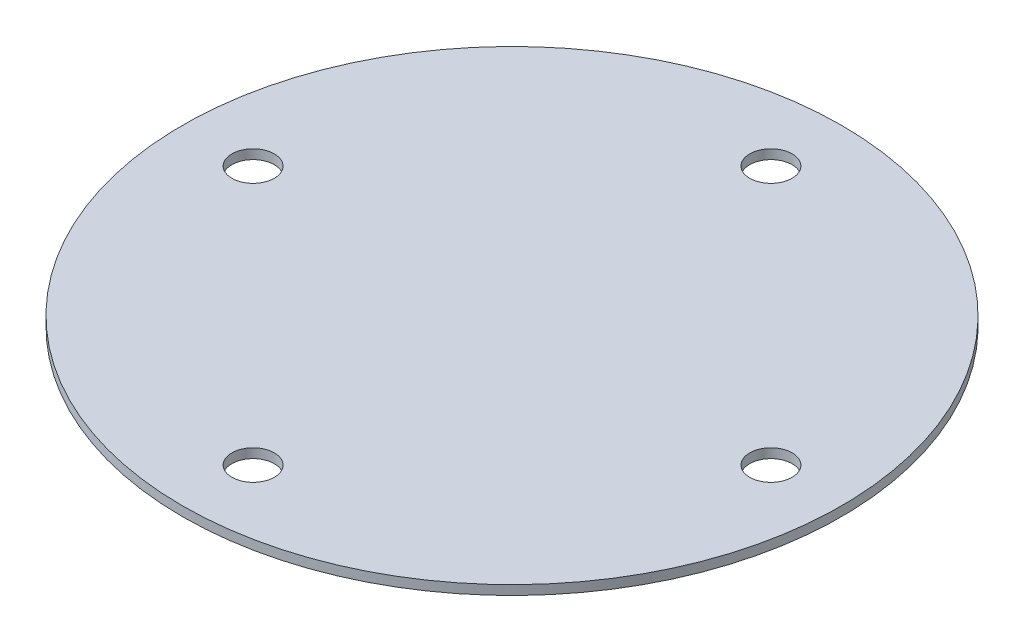
ISO-10303-21;
HEADER;
FILE_DESCRIPTION(('STEP AP214'),'2;1');
FILE_NAME('part.step','',(''),(''),'','','');
FILE_SCHEMA(('AUTOMOTIVE_DESIGN { 1 0 10303 214 1 1 1 1 }'));
ENDSEC;
DATA;
#1=APPLICATION_CONTEXT('core data for automotive mechanical design processes');
#2=APPLICATION_PROTOCOL_DEFINITION('international standard','automotive_design',2000,#1);
#3=PRODUCT_CONTEXT('',#1,'mechanical');
#4=PRODUCT('Part','Part','',(#3));
#5=PRODUCT_RELATED_PRODUCT_CATEGORY('part','',(#4));
#6=PRODUCT_DEFINITION_FORMATION('','',#4);
#7=PRODUCT_DEFINITION_CONTEXT('part definition',#1,'design');
#8=PRODUCT_DEFINITION('design','',#6,#7);
#9=PRODUCT_DEFINITION_SHAPE('','',#8);
#10=(LENGTH_UNIT() NAMED_UNIT(*) SI_UNIT(.MILLI.,.METRE.));
#11=(NAMED_UNIT(*) PLANE_ANGLE_UNIT() SI_UNIT($,.RADIAN.));
#12=(NAMED_UNIT(*) SI_UNIT($,.STERADIAN.) SOLID_ANGLE_UNIT());
#13=UNCERTAINTY_MEASURE_WITH_UNIT(LENGTH_MEASURE(1.E-05),#10,'distance_accuracy_value','');
#14=(GEOMETRIC_REPRESENTATION_CONTEXT(3) GLOBAL_UNCERTAINTY_ASSIGNED_CONTEXT((#13)) GLOBAL_UNIT_ASSIGNED_CONTEXT((#10,
#11,#12)) REPRESENTATION_CONTEXT('',''));
#15=CARTESIAN_POINT('',(0.,0.,0.));
#16=DIRECTION('',(0.,0.,1.));
#17=DIRECTION('',(1.,0.,0.));
#18=AXIS2_PLACEMENT_3D('',#15,#16,#17);
#19=CARTESIAN_POINT('',(0.,1.,0.));
#20=DIRECTION('',(0.,1.,0.));
#21=DIRECTION('',(0.,0.,1.));
#22=AXIS2_PLACEMENT_3D('',#19,#20,#21);
#23=PLANE('',#22);
#24=CARTESIAN_POINT('',(0.,1.,-27.5));
#25=DIRECTION('',(0.,1.,0.));
#26=DIRECTION('',(0.,0.,1.));
#27=AXIS2_PLACEMENT_3D('',#24,#25,#26);
#28=CIRCLE('',#27,2.25);
#29=CARTESIAN_POINT('',(0.,1.,-25.25));
#30=VERTEX_POINT('',#29);
#31=EDGE_CURVE('E64',#30,#30,#28,.T.);
#32=ORIENTED_EDGE('',*,*,#31,.F.);
#33=EDGE_LOOP('',(#32));
#34=FACE_BOUND('',#33,.T.);
#35=CARTESIAN_POINT('',(27.5,1.,0.));
#36=DIRECTION('',(0.,1.,0.));
#37=DIRECTION('',(0.,0.,1.));
#38=AXIS2_PLACEMENT_3D('',#35,#36,#37);
#39=CIRCLE('',#38,2.25);
#40=CARTESIAN_POINT('',(27.5,1.,2.25));
#41=VERTEX_POINT('',#40);
#42=EDGE_CURVE('E58',#41,#41,#39,.T.);
#43=ORIENTED_EDGE('',*,*,#42,.F.);
#44=EDGE_LOOP('',(#43));
#45=FACE_BOUND('',#44,.T.);
#46=CARTESIAN_POINT('',(0.,1.,27.5));
#47=DIRECTION('',(0.,1.,0.));
#48=DIRECTION('',(0.,0.,1.));
#49=AXIS2_PLACEMENT_3D('',#46,#47,#48);
#50=CIRCLE('',#49,2.25);
#51=CARTESIAN_POINT('',(0.,1.,29.75));
#52=VERTEX_POINT('',#51);
#53=EDGE_CURVE('E51',#52,#52,#50,.T.);
#54=ORIENTED_EDGE('',*,*,#53,.F.);
#55=EDGE_LOOP('',(#54));
#56=FACE_BOUND('',#55,.T.);
#57=CARTESIAN_POINT('',(-27.5,1.,0.));
#58=DIRECTION('',(0.,1.,0.));
#59=DIRECTION('',(0.,0.,1.));
#60=AXIS2_PLACEMENT_3D('',#57,#58,#59);
#61=CIRCLE('',#60,2.25);
#62=CARTESIAN_POINT('',(-27.5,1.,2.25000000000001));
#63=VERTEX_POINT('',#62);
#64=EDGE_CURVE('E52',#63,#63,#61,.T.);
#65=ORIENTED_EDGE('',*,*,#64,.F.);
#66=EDGE_LOOP('',(#65));
#67=FACE_BOUND('',#66,.T.);
#68=CARTESIAN_POINT('',(0.,1.,0.));
#69=DIRECTION('',(0.,1.,0.));
#70=DIRECTION('',(0.,0.,1.));
#71=AXIS2_PLACEMENT_3D('',#68,#69,#70);
#72=CIRCLE('',#71,35.);
#73=CARTESIAN_POINT('',(0.,1.,35.));
#74=VERTEX_POINT('',#73);
#75=EDGE_CURVE('E10',#74,#74,#72,.T.);
#76=ORIENTED_EDGE('',*,*,#75,.T.);
#77=EDGE_LOOP('',(#76));
#78=FACE_BOUND('',#77,.T.);
#79=ADVANCED_FACE('F35',(#34,#45,#56,#67,#78),#23,.T.);
#80=CARTESIAN_POINT('',(0.,0.,0.));
#81=DIRECTION('',(0.,1.,0.));
#82=DIRECTION('',(0.,0.,1.));
#83=AXIS2_PLACEMENT_3D('',#80,#81,#82);
#84=PLANE('',#83);
#85=CARTESIAN_POINT('',(0.,0.,-27.5));
#86=DIRECTION('',(0.,1.,0.));
#87=DIRECTION('',(0.,0.,1.));
#88=AXIS2_PLACEMENT_3D('',#85,#86,#87);
#89=CIRCLE('',#88,2.25);
#90=CARTESIAN_POINT('',(0.,0.,-25.25));
#91=VERTEX_POINT('',#90);
#92=EDGE_CURVE('E46',#91,#91,#89,.F.);
#93=ORIENTED_EDGE('',*,*,#92,.F.);
#94=EDGE_LOOP('',(#93));
#95=FACE_BOUND('',#94,.T.);
#96=CARTESIAN_POINT('',(27.5,0.,0.));
#97=DIRECTION('',(0.,1.,0.));
#98=DIRECTION('',(0.,0.,1.));
#99=AXIS2_PLACEMENT_3D('',#96,#97,#98);
#100=CIRCLE('',#99,2.25);
#101=CARTESIAN_POINT('',(27.5,0.,2.25));
#102=VERTEX_POINT('',#101);
#103=EDGE_CURVE('E61',#102,#102,#100,.F.);
#104=ORIENTED_EDGE('',*,*,#103,.F.);
#105=EDGE_LOOP('',(#104));
#106=FACE_BOUND('',#105,.T.);
#107=CARTESIAN_POINT('',(0.,0.,27.5));
#108=DIRECTION('',(0.,1.,0.));
#109=DIRECTION('',(0.,0.,1.));
#110=AXIS2_PLACEMENT_3D('',#107,#108,#109);
#111=CIRCLE('',#110,2.25);
#112=CARTESIAN_POINT('',(0.,0.,29.75));
#113=VERTEX_POINT('',#112);
#114=EDGE_CURVE('E55',#113,#113,#111,.F.);
#115=ORIENTED_EDGE('',*,*,#114,.F.);
#116=EDGE_LOOP('',(#115));
#117=FACE_BOUND('',#116,.T.);
#118=CARTESIAN_POINT('',(-27.5,0.,0.));
#119=DIRECTION('',(0.,1.,0.));
#120=DIRECTION('',(0.,0.,1.));
#121=AXIS2_PLACEMENT_3D('',#118,#119,#120);
#122=CIRCLE('',#121,2.25);
#123=CARTESIAN_POINT('',(-27.5,0.,2.25000000000001));
#124=VERTEX_POINT('',#123);
#125=EDGE_CURVE('E48',#124,#124,#122,.F.);
#126=ORIENTED_EDGE('',*,*,#125,.F.);
#127=EDGE_LOOP('',(#126));
#128=FACE_BOUND('',#127,.T.);
#129=CARTESIAN_POINT('',(0.,0.,0.));
#130=DIRECTION('',(0.,1.,0.));
#131=DIRECTION('',(0.,0.,1.));
#132=AXIS2_PLACEMENT_3D('',#129,#130,#131);
#133=CIRCLE('',#132,35.);
#134=CARTESIAN_POINT('',(0.,0.,35.));
#135=VERTEX_POINT('',#134);
#136=EDGE_CURVE('E39',#135,#135,#133,.T.);
#137=ORIENTED_EDGE('',*,*,#136,.F.);
#138=EDGE_LOOP('',(#137));
#139=FACE_BOUND('',#138,.T.);
#140=ADVANCED_FACE('F77',(#95,#106,#117,#128,#139),#84,.F.);
#141=CARTESIAN_POINT('',(0.,1.,0.));
#142=DIRECTION('',(0.,-1.,0.));
#143=DIRECTION('',(0.,0.,-1.));
#144=AXIS2_PLACEMENT_3D('',#141,#142,#143);
#145=CYLINDRICAL_SURFACE('',#144,35.);
#146=ORIENTED_EDGE('',*,*,#75,.F.);
#147=EDGE_LOOP('',(#146));
#148=FACE_BOUND('',#147,.T.);
#149=ORIENTED_EDGE('',*,*,#136,.T.);
#150=EDGE_LOOP('',(#149));
#151=FACE_BOUND('',#150,.T.);
#152=ADVANCED_FACE('F37',(#148,#151),#145,.T.);
#153=CARTESIAN_POINT('',(-27.5,-0.000999999999999916,0.));
#154=DIRECTION('',(0.,1.,0.));
#155=DIRECTION('',(0.,0.,1.));
#156=AXIS2_PLACEMENT_3D('',#153,#154,#155);
#157=CYLINDRICAL_SURFACE('',#156,2.25);
#158=ORIENTED_EDGE('',*,*,#64,.T.);
#159=EDGE_LOOP('',(#158));
#160=FACE_BOUND('',#159,.T.);
#161=ORIENTED_EDGE('',*,*,#125,.T.);
#162=EDGE_LOOP('',(#161));
#163=FACE_BOUND('',#162,.T.);
#164=ADVANCED_FACE('F85',(#160,#163),#157,.F.);
#165=CARTESIAN_POINT('',(0.,-0.000999999999999916,27.5));
#166=DIRECTION('',(0.,1.,0.));
#167=DIRECTION('',(0.,0.,1.));
#168=AXIS2_PLACEMENT_3D('',#165,#166,#167);
#169=CYLINDRICAL_SURFACE('',#168,2.25);
#170=ORIENTED_EDGE('',*,*,#53,.T.);
#171=EDGE_LOOP('',(#170));
#172=FACE_BOUND('',#171,.T.);
#173=ORIENTED_EDGE('',*,*,#114,.T.);
#174=EDGE_LOOP('',(#173));
#175=FACE_BOUND('',#174,.T.);
#176=ADVANCED_FACE('F88',(#172,#175),#169,.F.);
#177=CARTESIAN_POINT('',(27.5,-0.000999999999999916,0.));
#178=DIRECTION('',(0.,1.,0.));
#179=DIRECTION('',(0.,0.,1.));
#180=AXIS2_PLACEMENT_3D('',#177,#178,#179);
#181=CYLINDRICAL_SURFACE('',#180,2.25);
#182=ORIENTED_EDGE('',*,*,#42,.T.);
#183=EDGE_LOOP('',(#182));
#184=FACE_BOUND('',#183,.T.);
#185=ORIENTED_EDGE('',*,*,#103,.T.);
#186=EDGE_LOOP('',(#185));
#187=FACE_BOUND('',#186,.T.);
#188=ADVANCED_FACE('F121',(#184,#187),#181,.F.);
#189=CARTESIAN_POINT('',(0.,-0.000999999999999916,-27.5));
#190=DIRECTION('',(0.,1.,0.));
#191=DIRECTION('',(0.,0.,1.));
#192=AXIS2_PLACEMENT_3D('',#189,#190,#191);
#193=CYLINDRICAL_SURFACE('',#192,2.25);
#194=ORIENTED_EDGE('',*,*,#31,.T.);
#195=EDGE_LOOP('',(#194));
#196=FACE_BOUND('',#195,.T.);
#197=ORIENTED_EDGE('',*,*,#92,.T.);
#198=EDGE_LOOP('',(#197));
#199=FACE_BOUND('',#198,.T.);
#200=ADVANCED_FACE('F72',(#196,#199),#193,.F.);
#201=CLOSED_SHELL('',(#79,#140,#152,#164,#176,#188,#200));
#202=MANIFOLD_SOLID_BREP('B2',#201);
#203=ADVANCED_BREP_SHAPE_REPRESENTATION('',(#18,#202),#14);
#204=SHAPE_DEFINITION_REPRESENTATION(#9,#203);
ENDSEC;
END-ISO-10303-21;
